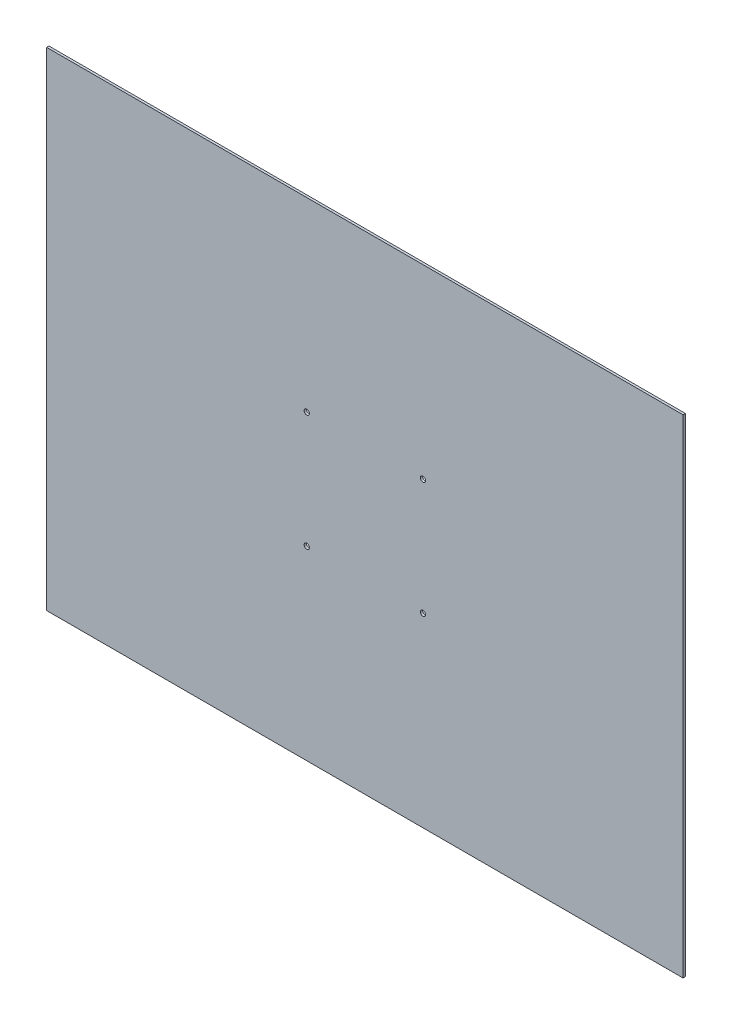
ISO-10303-21;
HEADER;
FILE_DESCRIPTION(('STEP AP214'),'2;1');
FILE_NAME('part.step','',(''),(''),'','','');
FILE_SCHEMA(('AUTOMOTIVE_DESIGN { 1 0 10303 214 1 1 1 1 }'));
ENDSEC;
DATA;
#1=APPLICATION_CONTEXT('core data for automotive mechanical design processes');
#2=APPLICATION_PROTOCOL_DEFINITION('international standard','automotive_design',2000,#1);
#3=PRODUCT_CONTEXT('',#1,'mechanical');
#4=PRODUCT('Part','Part','',(#3));
#5=PRODUCT_RELATED_PRODUCT_CATEGORY('part','',(#4));
#6=PRODUCT_DEFINITION_FORMATION('','',#4);
#7=PRODUCT_DEFINITION_CONTEXT('part definition',#1,'design');
#8=PRODUCT_DEFINITION('design','',#6,#7);
#9=PRODUCT_DEFINITION_SHAPE('','',#8);
#10=(LENGTH_UNIT() NAMED_UNIT(*) SI_UNIT(.MILLI.,.METRE.));
#11=(NAMED_UNIT(*) PLANE_ANGLE_UNIT() SI_UNIT($,.RADIAN.));
#12=(NAMED_UNIT(*) SI_UNIT($,.STERADIAN.) SOLID_ANGLE_UNIT());
#13=UNCERTAINTY_MEASURE_WITH_UNIT(LENGTH_MEASURE(1.E-05),#10,'distance_accuracy_value','');
#14=(GEOMETRIC_REPRESENTATION_CONTEXT(3) GLOBAL_UNCERTAINTY_ASSIGNED_CONTEXT((#13)) GLOBAL_UNIT_ASSIGNED_CONTEXT((#10,
#11,#12)) REPRESENTATION_CONTEXT('',''));
#15=CARTESIAN_POINT('',(0.,0.,0.));
#16=DIRECTION('',(0.,0.,1.));
#17=DIRECTION('',(1.,0.,0.));
#18=AXIS2_PLACEMENT_3D('',#15,#16,#17);
#19=CARTESIAN_POINT('',(0.,0.,110.));
#20=DIRECTION('',(0.,0.,1.));
#21=DIRECTION('',(1.,0.,0.));
#22=AXIS2_PLACEMENT_3D('',#19,#20,#21);
#23=PLANE('',#22);
#24=CARTESIAN_POINT('',(50.,50.,110.));
#25=DIRECTION('',(0.,0.,1.));
#26=DIRECTION('',(1.,0.,0.));
#27=AXIS2_PLACEMENT_3D('',#24,#25,#26);
#28=CIRCLE('',#27,2.25);
#29=CARTESIAN_POINT('',(52.25,50.,110.));
#30=VERTEX_POINT('',#29);
#31=EDGE_CURVE('E120',#30,#30,#28,.T.);
#32=ORIENTED_EDGE('',*,*,#31,.F.);
#33=EDGE_LOOP('',(#32));
#34=FACE_BOUND('',#33,.T.);
#35=CARTESIAN_POINT('',(50.,-50.,110.));
#36=DIRECTION('',(0.,0.,1.));
#37=DIRECTION('',(1.,0.,0.));
#38=AXIS2_PLACEMENT_3D('',#35,#36,#37);
#39=CIRCLE('',#38,2.25);
#40=CARTESIAN_POINT('',(52.25,-50.,110.));
#41=VERTEX_POINT('',#40);
#42=EDGE_CURVE('E116',#41,#41,#39,.T.);
#43=ORIENTED_EDGE('',*,*,#42,.F.);
#44=EDGE_LOOP('',(#43));
#45=FACE_BOUND('',#44,.T.);
#46=CARTESIAN_POINT('',(-50.,50.,110.));
#47=DIRECTION('',(0.,0.,1.));
#48=DIRECTION('',(1.,0.,0.));
#49=AXIS2_PLACEMENT_3D('',#46,#47,#48);
#50=CIRCLE('',#49,2.25);
#51=CARTESIAN_POINT('',(-47.75,50.,110.));
#52=VERTEX_POINT('',#51);
#53=EDGE_CURVE('E112',#52,#52,#50,.T.);
#54=ORIENTED_EDGE('',*,*,#53,.F.);
#55=EDGE_LOOP('',(#54));
#56=FACE_BOUND('',#55,.T.);
#57=CARTESIAN_POINT('',(-50.,-50.,110.));
#58=DIRECTION('',(0.,0.,1.));
#59=DIRECTION('',(1.,0.,0.));
#60=AXIS2_PLACEMENT_3D('',#57,#58,#59);
#61=CIRCLE('',#60,2.25);
#62=CARTESIAN_POINT('',(-47.75,-50.,110.));
#63=VERTEX_POINT('',#62);
#64=EDGE_CURVE('E76',#63,#63,#61,.T.);
#65=ORIENTED_EDGE('',*,*,#64,.F.);
#66=EDGE_LOOP('',(#65));
#67=FACE_BOUND('',#66,.T.);
#68=DIRECTION('',(-1.,0.,0.));
#69=VECTOR('',#68,1.);
#70=CARTESIAN_POINT('',(0.,-210.,110.));
#71=LINE('',#70,#69);
#72=CARTESIAN_POINT('',(274.,-210.,110.));
#73=VERTEX_POINT('',#72);
#74=CARTESIAN_POINT('',(-274.,-210.,110.));
#75=VERTEX_POINT('',#74);
#76=EDGE_CURVE('E10',#73,#75,#71,.T.);
#77=ORIENTED_EDGE('',*,*,#76,.F.);
#78=DIRECTION('',(0.,-1.,0.));
#79=VECTOR('',#78,1.);
#80=CARTESIAN_POINT('',(274.,0.,110.));
#81=LINE('',#80,#79);
#82=CARTESIAN_POINT('',(274.,210.,110.));
#83=VERTEX_POINT('',#82);
#84=EDGE_CURVE('E63',#83,#73,#81,.T.);
#85=ORIENTED_EDGE('',*,*,#84,.F.);
#86=DIRECTION('',(1.,0.,0.));
#87=VECTOR('',#86,1.);
#88=CARTESIAN_POINT('',(0.,210.,110.));
#89=LINE('',#88,#87);
#90=CARTESIAN_POINT('',(-274.,210.,110.));
#91=VERTEX_POINT('',#90);
#92=EDGE_CURVE('E103',#91,#83,#89,.T.);
#93=ORIENTED_EDGE('',*,*,#92,.F.);
#94=DIRECTION('',(0.,1.,0.));
#95=VECTOR('',#94,1.);
#96=CARTESIAN_POINT('',(-274.,0.,110.));
#97=LINE('',#96,#95);
#98=EDGE_CURVE('E25',#75,#91,#97,.T.);
#99=ORIENTED_EDGE('',*,*,#98,.F.);
#100=EDGE_LOOP('',(#77,#85,#93,#99));
#101=FACE_BOUND('',#100,.T.);
#102=ADVANCED_FACE('F16',(#34,#45,#56,#67,#101),#23,.T.);
#103=CARTESIAN_POINT('',(0.,-210.,108.));
#104=DIRECTION('',(0.,-1.,0.));
#105=DIRECTION('',(0.,0.,-1.));
#106=AXIS2_PLACEMENT_3D('',#103,#104,#105);
#107=PLANE('',#106);
#108=DIRECTION('',(0.,0.,1.));
#109=VECTOR('',#108,1.);
#110=CARTESIAN_POINT('',(274.,-210.,108.));
#111=LINE('',#110,#109);
#112=CARTESIAN_POINT('',(274.,-210.,108.));
#113=VERTEX_POINT('',#112);
#114=EDGE_CURVE('E56',#113,#73,#111,.T.);
#115=ORIENTED_EDGE('',*,*,#114,.T.);
#116=ORIENTED_EDGE('',*,*,#76,.T.);
#117=DIRECTION('',(0.,0.,1.));
#118=VECTOR('',#117,1.);
#119=CARTESIAN_POINT('',(-274.,-210.,108.));
#120=LINE('',#119,#118);
#121=CARTESIAN_POINT('',(-274.,-210.,108.));
#122=VERTEX_POINT('',#121);
#123=EDGE_CURVE('E70',#122,#75,#120,.T.);
#124=ORIENTED_EDGE('',*,*,#123,.F.);
#125=DIRECTION('',(1.,0.,0.));
#126=VECTOR('',#125,1.);
#127=CARTESIAN_POINT('',(0.,-210.,108.));
#128=LINE('',#127,#126);
#129=EDGE_CURVE('E68',#122,#113,#128,.T.);
#130=ORIENTED_EDGE('',*,*,#129,.T.);
#131=EDGE_LOOP('',(#115,#116,#124,#130));
#132=FACE_BOUND('',#131,.T.);
#133=ADVANCED_FACE('F69',(#132),#107,.T.);
#134=CARTESIAN_POINT('',(-274.,0.,108.));
#135=DIRECTION('',(-1.,0.,0.));
#136=DIRECTION('',(0.,0.,1.));
#137=AXIS2_PLACEMENT_3D('',#134,#135,#136);
#138=PLANE('',#137);
#139=ORIENTED_EDGE('',*,*,#123,.T.);
#140=ORIENTED_EDGE('',*,*,#98,.T.);
#141=DIRECTION('',(0.,0.,1.));
#142=VECTOR('',#141,1.);
#143=CARTESIAN_POINT('',(-274.,210.,108.));
#144=LINE('',#143,#142);
#145=CARTESIAN_POINT('',(-274.,210.,108.));
#146=VERTEX_POINT('',#145);
#147=EDGE_CURVE('E95',#146,#91,#144,.T.);
#148=ORIENTED_EDGE('',*,*,#147,.F.);
#149=DIRECTION('',(0.,-1.,0.));
#150=VECTOR('',#149,1.);
#151=CARTESIAN_POINT('',(-274.,0.,108.));
#152=LINE('',#151,#150);
#153=EDGE_CURVE('E75',#146,#122,#152,.T.);
#154=ORIENTED_EDGE('',*,*,#153,.T.);
#155=EDGE_LOOP('',(#139,#140,#148,#154));
#156=FACE_BOUND('',#155,.T.);
#157=ADVANCED_FACE('F144',(#156),#138,.T.);
#158=CARTESIAN_POINT('',(0.,210.,108.));
#159=DIRECTION('',(0.,1.,0.));
#160=DIRECTION('',(0.,0.,1.));
#161=AXIS2_PLACEMENT_3D('',#158,#159,#160);
#162=PLANE('',#161);
#163=ORIENTED_EDGE('',*,*,#147,.T.);
#164=ORIENTED_EDGE('',*,*,#92,.T.);
#165=DIRECTION('',(0.,0.,1.));
#166=VECTOR('',#165,1.);
#167=CARTESIAN_POINT('',(274.,210.,108.));
#168=LINE('',#167,#166);
#169=CARTESIAN_POINT('',(274.,210.,108.));
#170=VERTEX_POINT('',#169);
#171=EDGE_CURVE('E65',#170,#83,#168,.T.);
#172=ORIENTED_EDGE('',*,*,#171,.F.);
#173=DIRECTION('',(-1.,0.,0.));
#174=VECTOR('',#173,1.);
#175=CARTESIAN_POINT('',(0.,210.,108.));
#176=LINE('',#175,#174);
#177=EDGE_CURVE('E81',#170,#146,#176,.T.);
#178=ORIENTED_EDGE('',*,*,#177,.T.);
#179=EDGE_LOOP('',(#163,#164,#172,#178));
#180=FACE_BOUND('',#179,.T.);
#181=ADVANCED_FACE('F146',(#180),#162,.T.);
#182=CARTESIAN_POINT('',(0.,0.,108.));
#183=DIRECTION('',(0.,0.,-1.));
#184=DIRECTION('',(-1.,0.,0.));
#185=AXIS2_PLACEMENT_3D('',#182,#183,#184);
#186=PLANE('',#185);
#187=CARTESIAN_POINT('',(50.,50.,108.));
#188=DIRECTION('',(0.,0.,-1.));
#189=DIRECTION('',(-1.,0.,0.));
#190=AXIS2_PLACEMENT_3D('',#187,#188,#189);
#191=CIRCLE('',#190,2.25);
#192=CARTESIAN_POINT('',(47.75,50.,108.));
#193=VERTEX_POINT('',#192);
#194=EDGE_CURVE('E19',#193,#193,#191,.T.);
#195=ORIENTED_EDGE('',*,*,#194,.F.);
#196=EDGE_LOOP('',(#195));
#197=FACE_BOUND('',#196,.T.);
#198=CARTESIAN_POINT('',(50.,-50.,108.));
#199=DIRECTION('',(0.,0.,-1.));
#200=DIRECTION('',(-1.,0.,0.));
#201=AXIS2_PLACEMENT_3D('',#198,#199,#200);
#202=CIRCLE('',#201,2.25);
#203=CARTESIAN_POINT('',(47.75,-50.,108.));
#204=VERTEX_POINT('',#203);
#205=EDGE_CURVE('E117',#204,#204,#202,.T.);
#206=ORIENTED_EDGE('',*,*,#205,.F.);
#207=EDGE_LOOP('',(#206));
#208=FACE_BOUND('',#207,.T.);
#209=CARTESIAN_POINT('',(-50.,50.,108.));
#210=DIRECTION('',(0.,0.,-1.));
#211=DIRECTION('',(-1.,0.,0.));
#212=AXIS2_PLACEMENT_3D('',#209,#210,#211);
#213=CIRCLE('',#212,2.25);
#214=CARTESIAN_POINT('',(-52.25,50.,108.));
#215=VERTEX_POINT('',#214);
#216=EDGE_CURVE('E113',#215,#215,#213,.T.);
#217=ORIENTED_EDGE('',*,*,#216,.F.);
#218=EDGE_LOOP('',(#217));
#219=FACE_BOUND('',#218,.T.);
#220=CARTESIAN_POINT('',(-50.,-50.,108.));
#221=DIRECTION('',(0.,0.,-1.));
#222=DIRECTION('',(-1.,0.,0.));
#223=AXIS2_PLACEMENT_3D('',#220,#221,#222);
#224=CIRCLE('',#223,2.25);
#225=CARTESIAN_POINT('',(-52.25,-50.,108.));
#226=VERTEX_POINT('',#225);
#227=EDGE_CURVE('E108',#226,#226,#224,.T.);
#228=ORIENTED_EDGE('',*,*,#227,.F.);
#229=EDGE_LOOP('',(#228));
#230=FACE_BOUND('',#229,.T.);
#231=DIRECTION('',(0.,1.,0.));
#232=VECTOR('',#231,1.);
#233=CARTESIAN_POINT('',(274.,0.,108.));
#234=LINE('',#233,#232);
#235=EDGE_CURVE('E61',#113,#170,#234,.T.);
#236=ORIENTED_EDGE('',*,*,#235,.F.);
#237=ORIENTED_EDGE('',*,*,#129,.F.);
#238=ORIENTED_EDGE('',*,*,#153,.F.);
#239=ORIENTED_EDGE('',*,*,#177,.F.);
#240=EDGE_LOOP('',(#236,#237,#238,#239));
#241=FACE_BOUND('',#240,.T.);
#242=ADVANCED_FACE('F79',(#197,#208,#219,#230,#241),#186,.T.);
#243=CARTESIAN_POINT('',(274.,0.,108.));
#244=DIRECTION('',(1.,0.,0.));
#245=DIRECTION('',(0.,0.,-1.));
#246=AXIS2_PLACEMENT_3D('',#243,#244,#245);
#247=PLANE('',#246);
#248=ORIENTED_EDGE('',*,*,#235,.T.);
#249=ORIENTED_EDGE('',*,*,#171,.T.);
#250=ORIENTED_EDGE('',*,*,#84,.T.);
#251=ORIENTED_EDGE('',*,*,#114,.F.);
#252=EDGE_LOOP('',(#248,#249,#250,#251));
#253=FACE_BOUND('',#252,.T.);
#254=ADVANCED_FACE('F58',(#253),#247,.T.);
#255=CARTESIAN_POINT('',(-50.,-50.,107.7));
#256=DIRECTION('',(0.,0.,1.));
#257=DIRECTION('',(1.,0.,0.));
#258=AXIS2_PLACEMENT_3D('',#255,#256,#257);
#259=CYLINDRICAL_SURFACE('',#258,2.25);
#260=ORIENTED_EDGE('',*,*,#64,.T.);
#261=EDGE_LOOP('',(#260));
#262=FACE_BOUND('',#261,.T.);
#263=ORIENTED_EDGE('',*,*,#227,.T.);
#264=EDGE_LOOP('',(#263));
#265=FACE_BOUND('',#264,.T.);
#266=ADVANCED_FACE('F138',(#262,#265),#259,.F.);
#267=CARTESIAN_POINT('',(-50.,50.,107.7));
#268=DIRECTION('',(0.,0.,1.));
#269=DIRECTION('',(1.,0.,0.));
#270=AXIS2_PLACEMENT_3D('',#267,#268,#269);
#271=CYLINDRICAL_SURFACE('',#270,2.25);
#272=ORIENTED_EDGE('',*,*,#53,.T.);
#273=EDGE_LOOP('',(#272));
#274=FACE_BOUND('',#273,.T.);
#275=ORIENTED_EDGE('',*,*,#216,.T.);
#276=EDGE_LOOP('',(#275));
#277=FACE_BOUND('',#276,.T.);
#278=ADVANCED_FACE('F197',(#274,#277),#271,.F.);
#279=CARTESIAN_POINT('',(50.,-50.,107.7));
#280=DIRECTION('',(0.,0.,1.));
#281=DIRECTION('',(1.,0.,0.));
#282=AXIS2_PLACEMENT_3D('',#279,#280,#281);
#283=CYLINDRICAL_SURFACE('',#282,2.25);
#284=ORIENTED_EDGE('',*,*,#42,.T.);
#285=EDGE_LOOP('',(#284));
#286=FACE_BOUND('',#285,.T.);
#287=ORIENTED_EDGE('',*,*,#205,.T.);
#288=EDGE_LOOP('',(#287));
#289=FACE_BOUND('',#288,.T.);
#290=ADVANCED_FACE('F206',(#286,#289),#283,.F.);
#291=CARTESIAN_POINT('',(50.,50.,107.7));
#292=DIRECTION('',(0.,0.,1.));
#293=DIRECTION('',(1.,0.,0.));
#294=AXIS2_PLACEMENT_3D('',#291,#292,#293);
#295=CYLINDRICAL_SURFACE('',#294,2.25);
#296=ORIENTED_EDGE('',*,*,#31,.T.);
#297=EDGE_LOOP('',(#296));
#298=FACE_BOUND('',#297,.T.);
#299=ORIENTED_EDGE('',*,*,#194,.T.);
#300=EDGE_LOOP('',(#299));
#301=FACE_BOUND('',#300,.T.);
#302=ADVANCED_FACE('F216',(#298,#301),#295,.F.);
#303=CLOSED_SHELL('',(#102,#133,#157,#181,#242,#254,#266,#278,#290,#302));
#304=MANIFOLD_SOLID_BREP('B1',#303);
#305=ADVANCED_BREP_SHAPE_REPRESENTATION('',(#18,#304),#14);
#306=SHAPE_DEFINITION_REPRESENTATION(#9,#305);
ENDSEC;
END-ISO-10303-21;
